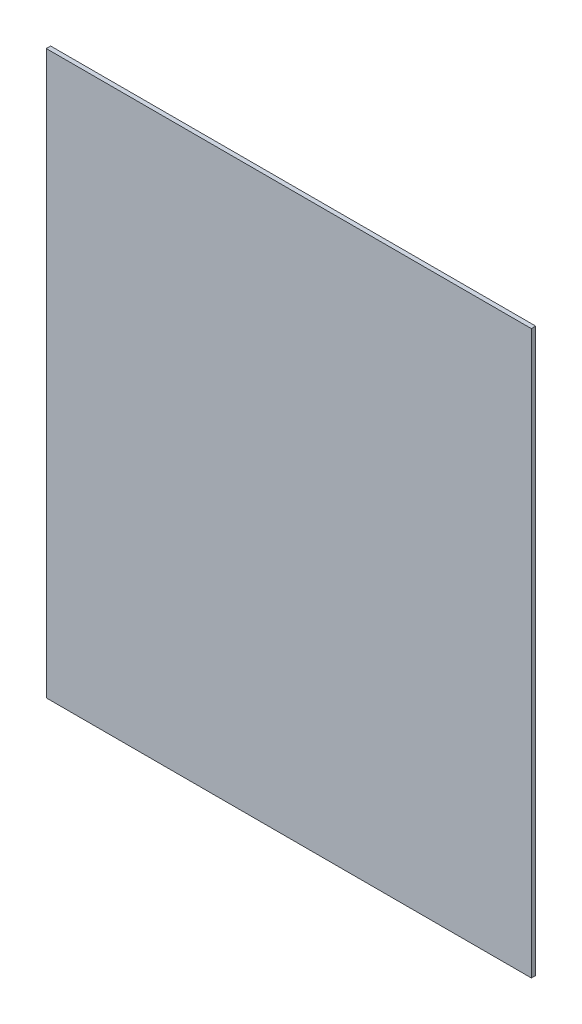
ISO-10303-21;
HEADER;
FILE_DESCRIPTION(('STEP AP214'),'2;1');
FILE_NAME('part.step','',(''),(''),'','','');
FILE_SCHEMA(('AUTOMOTIVE_DESIGN { 1 0 10303 214 1 1 1 1 }'));
ENDSEC;
DATA;
#1=APPLICATION_CONTEXT('core data for automotive mechanical design processes');
#2=APPLICATION_PROTOCOL_DEFINITION('international standard','automotive_design',2000,#1);
#3=PRODUCT_CONTEXT('',#1,'mechanical');
#4=PRODUCT('Part','Part','',(#3));
#5=PRODUCT_RELATED_PRODUCT_CATEGORY('part','',(#4));
#6=PRODUCT_DEFINITION_FORMATION('','',#4);
#7=PRODUCT_DEFINITION_CONTEXT('part definition',#1,'design');
#8=PRODUCT_DEFINITION('design','',#6,#7);
#9=PRODUCT_DEFINITION_SHAPE('','',#8);
#10=(LENGTH_UNIT() NAMED_UNIT(*) SI_UNIT(.MILLI.,.METRE.));
#11=(NAMED_UNIT(*) PLANE_ANGLE_UNIT() SI_UNIT($,.RADIAN.));
#12=(NAMED_UNIT(*) SI_UNIT($,.STERADIAN.) SOLID_ANGLE_UNIT());
#13=UNCERTAINTY_MEASURE_WITH_UNIT(LENGTH_MEASURE(1.E-05),#10,'distance_accuracy_value','');
#14=(GEOMETRIC_REPRESENTATION_CONTEXT(3) GLOBAL_UNCERTAINTY_ASSIGNED_CONTEXT((#13)) GLOBAL_UNIT_ASSIGNED_CONTEXT((#10,
#11,#12)) REPRESENTATION_CONTEXT('',''));
#15=CARTESIAN_POINT('',(0.,0.,0.));
#16=DIRECTION('',(0.,0.,1.));
#17=DIRECTION('',(1.,0.,0.));
#18=AXIS2_PLACEMENT_3D('',#15,#16,#17);
#19=CARTESIAN_POINT('',(361.,-418.5,6.5));
#20=DIRECTION('',(-1.,0.,0.));
#21=DIRECTION('',(0.,0.,1.));
#22=AXIS2_PLACEMENT_3D('',#19,#20,#21);
#23=PLANE('',#22);
#24=DIRECTION('',(0.,1.,0.));
#25=VECTOR('',#24,1.);
#26=CARTESIAN_POINT('',(361.,-418.5,0.));
#27=LINE('',#26,#25);
#28=CARTESIAN_POINT('',(361.,-418.5,0.));
#29=VERTEX_POINT('',#28);
#30=CARTESIAN_POINT('',(361.,418.5,0.));
#31=VERTEX_POINT('',#30);
#32=EDGE_CURVE('E96',#29,#31,#27,.T.);
#33=ORIENTED_EDGE('',*,*,#32,.T.);
#34=DIRECTION('',(0.,0.,-1.));
#35=VECTOR('',#34,1.);
#36=CARTESIAN_POINT('',(361.,418.5,6.5));
#37=LINE('',#36,#35);
#38=CARTESIAN_POINT('',(361.,418.5,6.5));
#39=VERTEX_POINT('',#38);
#40=EDGE_CURVE('E11',#39,#31,#37,.T.);
#41=ORIENTED_EDGE('',*,*,#40,.F.);
#42=DIRECTION('',(0.,1.,0.));
#43=VECTOR('',#42,1.);
#44=CARTESIAN_POINT('',(361.,-418.5,6.5));
#45=LINE('',#44,#43);
#46=CARTESIAN_POINT('',(361.,-418.5,6.5));
#47=VERTEX_POINT('',#46);
#48=EDGE_CURVE('E84',#47,#39,#45,.T.);
#49=ORIENTED_EDGE('',*,*,#48,.F.);
#50=DIRECTION('',(0.,0.,-1.));
#51=VECTOR('',#50,1.);
#52=CARTESIAN_POINT('',(361.,-418.5,6.5));
#53=LINE('',#52,#51);
#54=EDGE_CURVE('E92',#47,#29,#53,.T.);
#55=ORIENTED_EDGE('',*,*,#54,.T.);
#56=EDGE_LOOP('',(#33,#41,#49,#55));
#57=FACE_BOUND('',#56,.T.);
#58=ADVANCED_FACE('F33',(#57),#23,.F.);
#59=CARTESIAN_POINT('',(-361.,418.5,6.5));
#60=DIRECTION('',(0.,-1.,0.));
#61=DIRECTION('',(0.,0.,-1.));
#62=AXIS2_PLACEMENT_3D('',#59,#60,#61);
#63=PLANE('',#62);
#64=DIRECTION('',(-1.,0.,0.));
#65=VECTOR('',#64,1.);
#66=CARTESIAN_POINT('',(-361.,418.5,0.));
#67=LINE('',#66,#65);
#68=CARTESIAN_POINT('',(-361.,418.5,0.));
#69=VERTEX_POINT('',#68);
#70=EDGE_CURVE('E88',#31,#69,#67,.T.);
#71=ORIENTED_EDGE('',*,*,#70,.T.);
#72=DIRECTION('',(0.,0.,-1.));
#73=VECTOR('',#72,1.);
#74=CARTESIAN_POINT('',(-361.,418.5,6.5));
#75=LINE('',#74,#73);
#76=CARTESIAN_POINT('',(-361.,418.5,6.5));
#77=VERTEX_POINT('',#76);
#78=EDGE_CURVE('E41',#77,#69,#75,.T.);
#79=ORIENTED_EDGE('',*,*,#78,.F.);
#80=DIRECTION('',(-1.,0.,0.));
#81=VECTOR('',#80,1.);
#82=CARTESIAN_POINT('',(-361.,418.5,6.5));
#83=LINE('',#82,#81);
#84=EDGE_CURVE('E79',#39,#77,#83,.T.);
#85=ORIENTED_EDGE('',*,*,#84,.F.);
#86=ORIENTED_EDGE('',*,*,#40,.T.);
#87=EDGE_LOOP('',(#71,#79,#85,#86));
#88=FACE_BOUND('',#87,.T.);
#89=ADVANCED_FACE('F87',(#88),#63,.F.);
#90=CARTESIAN_POINT('',(-361.,-418.5,6.5));
#91=DIRECTION('',(1.,0.,0.));
#92=DIRECTION('',(0.,0.,-1.));
#93=AXIS2_PLACEMENT_3D('',#90,#91,#92);
#94=PLANE('',#93);
#95=DIRECTION('',(0.,-1.,0.));
#96=VECTOR('',#95,1.);
#97=CARTESIAN_POINT('',(-361.,-418.5,0.));
#98=LINE('',#97,#96);
#99=CARTESIAN_POINT('',(-361.,-418.5,0.));
#100=VERTEX_POINT('',#99);
#101=EDGE_CURVE('E66',#69,#100,#98,.T.);
#102=ORIENTED_EDGE('',*,*,#101,.T.);
#103=DIRECTION('',(0.,0.,-1.));
#104=VECTOR('',#103,1.);
#105=CARTESIAN_POINT('',(-361.,-418.5,6.5));
#106=LINE('',#105,#104);
#107=CARTESIAN_POINT('',(-361.,-418.5,6.5));
#108=VERTEX_POINT('',#107);
#109=EDGE_CURVE('E89',#108,#100,#106,.T.);
#110=ORIENTED_EDGE('',*,*,#109,.F.);
#111=DIRECTION('',(0.,-1.,0.));
#112=VECTOR('',#111,1.);
#113=CARTESIAN_POINT('',(-361.,-418.5,6.5));
#114=LINE('',#113,#112);
#115=EDGE_CURVE('E82',#77,#108,#114,.T.);
#116=ORIENTED_EDGE('',*,*,#115,.F.);
#117=ORIENTED_EDGE('',*,*,#78,.T.);
#118=EDGE_LOOP('',(#102,#110,#116,#117));
#119=FACE_BOUND('',#118,.T.);
#120=ADVANCED_FACE('F90',(#119),#94,.F.);
#121=CARTESIAN_POINT('',(-361.,-418.5,6.5));
#122=DIRECTION('',(0.,1.,0.));
#123=DIRECTION('',(0.,0.,1.));
#124=AXIS2_PLACEMENT_3D('',#121,#122,#123);
#125=PLANE('',#124);
#126=DIRECTION('',(1.,0.,0.));
#127=VECTOR('',#126,1.);
#128=CARTESIAN_POINT('',(-361.,-418.5,0.));
#129=LINE('',#128,#127);
#130=EDGE_CURVE('E72',#100,#29,#129,.T.);
#131=ORIENTED_EDGE('',*,*,#130,.T.);
#132=ORIENTED_EDGE('',*,*,#54,.F.);
#133=DIRECTION('',(1.,0.,0.));
#134=VECTOR('',#133,1.);
#135=CARTESIAN_POINT('',(-361.,-418.5,6.5));
#136=LINE('',#135,#134);
#137=EDGE_CURVE('E49',#108,#47,#136,.T.);
#138=ORIENTED_EDGE('',*,*,#137,.F.);
#139=ORIENTED_EDGE('',*,*,#109,.T.);
#140=EDGE_LOOP('',(#131,#132,#138,#139));
#141=FACE_BOUND('',#140,.T.);
#142=ADVANCED_FACE('F103',(#141),#125,.F.);
#143=CARTESIAN_POINT('',(0.,0.,6.5));
#144=DIRECTION('',(0.,0.,-1.));
#145=DIRECTION('',(-1.,0.,0.));
#146=AXIS2_PLACEMENT_3D('',#143,#144,#145);
#147=PLANE('',#146);
#148=ORIENTED_EDGE('',*,*,#48,.T.);
#149=ORIENTED_EDGE('',*,*,#84,.T.);
#150=ORIENTED_EDGE('',*,*,#115,.T.);
#151=ORIENTED_EDGE('',*,*,#137,.T.);
#152=EDGE_LOOP('',(#148,#149,#150,#151));
#153=FACE_BOUND('',#152,.T.);
#154=ADVANCED_FACE('F80',(#153),#147,.F.);
#155=CARTESIAN_POINT('',(0.,0.,0.));
#156=DIRECTION('',(0.,0.,-1.));
#157=DIRECTION('',(-1.,0.,0.));
#158=AXIS2_PLACEMENT_3D('',#155,#156,#157);
#159=PLANE('',#158);
#160=ORIENTED_EDGE('',*,*,#32,.F.);
#161=ORIENTED_EDGE('',*,*,#130,.F.);
#162=ORIENTED_EDGE('',*,*,#101,.F.);
#163=ORIENTED_EDGE('',*,*,#70,.F.);
#164=EDGE_LOOP('',(#160,#161,#162,#163));
#165=FACE_BOUND('',#164,.T.);
#166=ADVANCED_FACE('F106',(#165),#159,.T.);
#167=CLOSED_SHELL('',(#58,#89,#120,#142,#154,#166));
#168=MANIFOLD_SOLID_BREP('B2',#167);
#169=ADVANCED_BREP_SHAPE_REPRESENTATION('',(#18,#168),#14);
#170=SHAPE_DEFINITION_REPRESENTATION(#9,#169);
ENDSEC;
END-ISO-10303-21;
